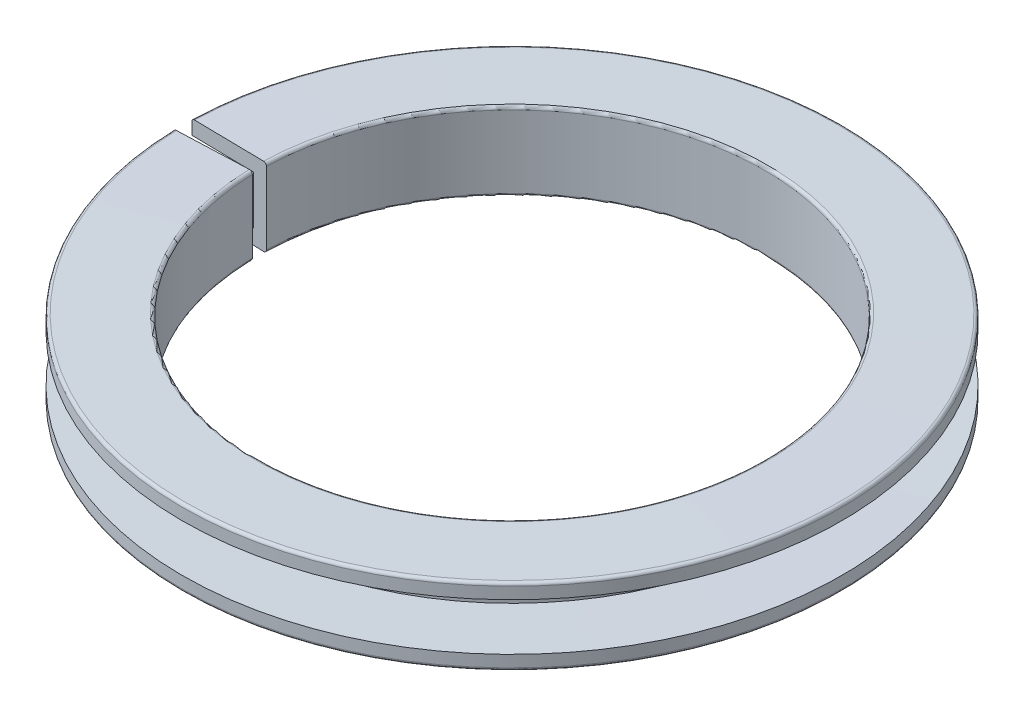
ISO-10303-21;
HEADER;
FILE_DESCRIPTION(('STEP AP214'),'2;1');
FILE_NAME('part.step','',(''),(''),'','','');
FILE_SCHEMA(('AUTOMOTIVE_DESIGN { 1 0 10303 214 1 1 1 1 }'));
ENDSEC;
DATA;
#1=APPLICATION_CONTEXT('core data for automotive mechanical design processes');
#2=APPLICATION_PROTOCOL_DEFINITION('international standard','automotive_design',2000,#1);
#3=PRODUCT_CONTEXT('',#1,'mechanical');
#4=PRODUCT('Part','Part','',(#3));
#5=PRODUCT_RELATED_PRODUCT_CATEGORY('part','',(#4));
#6=PRODUCT_DEFINITION_FORMATION('','',#4);
#7=PRODUCT_DEFINITION_CONTEXT('part definition',#1,'design');
#8=PRODUCT_DEFINITION('design','',#6,#7);
#9=PRODUCT_DEFINITION_SHAPE('','',#8);
#10=(LENGTH_UNIT() NAMED_UNIT(*) SI_UNIT(.MILLI.,.METRE.));
#11=(NAMED_UNIT(*) PLANE_ANGLE_UNIT() SI_UNIT($,.RADIAN.));
#12=(NAMED_UNIT(*) SI_UNIT($,.STERADIAN.) SOLID_ANGLE_UNIT());
#13=UNCERTAINTY_MEASURE_WITH_UNIT(LENGTH_MEASURE(1.E-05),#10,'distance_accuracy_value','');
#14=(GEOMETRIC_REPRESENTATION_CONTEXT(3) GLOBAL_UNCERTAINTY_ASSIGNED_CONTEXT((#13)) GLOBAL_UNIT_ASSIGNED_CONTEXT((#10,
#11,#12)) REPRESENTATION_CONTEXT('',''));
#15=CARTESIAN_POINT('',(0.,0.,0.));
#16=DIRECTION('',(0.,0.,1.));
#17=DIRECTION('',(1.,0.,0.));
#18=AXIS2_PLACEMENT_3D('',#15,#16,#17);
#19=CARTESIAN_POINT('',(-40.0914721200761,-2.39184694475121,-0.613888888888911));
#20=DIRECTION('',(0.0277777777777788,0.,-0.999614123080366));
#21=DIRECTION('',(-0.999614123080366,0.,-0.0277777777777788));
#22=AXIS2_PLACEMENT_3D('',#19,#20,#21);
#23=PLANE('',#22);
#24=DIRECTION('',(0.,1.,0.));
#25=VECTOR('',#24,1.);
#26=CARTESIAN_POINT('',(-35.9930542154466,1.65,-0.500000000000018));
#27=LINE('',#26,#25);
#28=CARTESIAN_POINT('',(-35.9930542154466,-1.65,-0.500000000000018));
#29=VERTEX_POINT('',#28);
#30=CARTESIAN_POINT('',(-35.9930542154466,1.65,-0.500000000000018));
#31=VERTEX_POINT('',#30);
#32=EDGE_CURVE('E69',#29,#31,#27,.T.);
#33=ORIENTED_EDGE('',*,*,#32,.F.);
#34=DIRECTION('',(0.999546551908958,-0.0116271209621438,0.0277759000762335));
#35=VECTOR('',#34,1.);
#36=CARTESIAN_POINT('',(-35.9930542154466,-1.65,-0.500000000000018));
#37=LINE('',#36,#35);
#38=CARTESIAN_POINT('',(-40.2913949446922,-1.6,-0.619444444444466));
#39=VERTEX_POINT('',#38);
#40=EDGE_CURVE('E74',#39,#29,#37,.T.);
#41=ORIENTED_EDGE('',*,*,#40,.F.);
#42=DIRECTION('',(0.,1.,0.));
#43=VECTOR('',#42,1.);
#44=CARTESIAN_POINT('',(-40.2913949446922,-1.6,-0.619444444444467));
#45=LINE('',#44,#43);
#46=CARTESIAN_POINT('',(-40.2913949446922,-2.39184694475121,-0.619444444444466));
#47=VERTEX_POINT('',#46);
#48=EDGE_CURVE('E197',#47,#39,#45,.T.);
#49=ORIENTED_EDGE('',*,*,#48,.F.);
#50=CARTESIAN_POINT('',(-40.0914721200761,-2.39184694475121,-0.613888888888911));
#51=DIRECTION('',(0.0277777777777788,0.,-0.999614123080366));
#52=DIRECTION('',(-0.999614123080366,0.,-0.0277777777777788));
#53=AXIS2_PLACEMENT_3D('',#50,#51,#52);
#54=CIRCLE('',#53,0.2);
#55=CARTESIAN_POINT('',(-40.093796646941,-2.59183342530009,-0.613953484005367));
#56=VERTEX_POINT('',#55);
#57=EDGE_CURVE('E189',#56,#47,#54,.T.);
#58=ORIENTED_EDGE('',*,*,#57,.F.);
#59=DIRECTION('',(-0.999546551908958,0.0116271209621438,-0.0277759000762335));
#60=VECTOR('',#59,1.);
#61=CARTESIAN_POINT('',(-35.2956488561552,-2.64764737878846,-0.480620150672029));
#62=LINE('',#61,#60);
#63=CARTESIAN_POINT('',(-35.2956488561552,-2.64764737878846,-0.480620150672029));
#64=VERTEX_POINT('',#63);
#65=EDGE_CURVE('E181',#64,#56,#62,.T.);
#66=ORIENTED_EDGE('',*,*,#65,.F.);
#67=CARTESIAN_POINT('',(-35.2933243292903,-2.44766089823959,-0.480555555555573));
#68=DIRECTION('',(0.0277777777777788,0.,-0.999614123080366));
#69=DIRECTION('',(-0.999614123080366,0.,-0.0277777777777788));
#70=AXIS2_PLACEMENT_3D('',#67,#68,#69);
#71=CIRCLE('',#70,0.2);
#72=CARTESIAN_POINT('',(-35.0934015046742,-2.44766089823958,-0.475000000000017));
#73=VERTEX_POINT('',#72);
#74=EDGE_CURVE('E173',#73,#64,#71,.T.);
#75=ORIENTED_EDGE('',*,*,#74,.F.);
#76=DIRECTION('',(0.,-1.,0.));
#77=VECTOR('',#76,1.);
#78=CARTESIAN_POINT('',(-35.0934015046742,2.44766089823958,-0.475000000000017));
#79=LINE('',#78,#77);
#80=CARTESIAN_POINT('',(-35.0934015046742,2.44766089823958,-0.475000000000017));
#81=VERTEX_POINT('',#80);
#82=EDGE_CURVE('E165',#81,#73,#79,.T.);
#83=ORIENTED_EDGE('',*,*,#82,.F.);
#84=CARTESIAN_POINT('',(-35.2933243292903,2.44766089823959,-0.480555555555573));
#85=DIRECTION('',(0.0277777777777788,0.,-0.999614123080366));
#86=DIRECTION('',(-0.999614123080366,0.,-0.0277777777777788));
#87=AXIS2_PLACEMENT_3D('',#84,#85,#86);
#88=CIRCLE('',#87,0.2);
#89=CARTESIAN_POINT('',(-35.2956488561552,2.64764737878846,-0.480620150672029));
#90=VERTEX_POINT('',#89);
#91=EDGE_CURVE('E157',#90,#81,#88,.T.);
#92=ORIENTED_EDGE('',*,*,#91,.F.);
#93=DIRECTION('',(0.999546551908958,0.0116271209621438,0.0277759000762335));
#94=VECTOR('',#93,1.);
#95=CARTESIAN_POINT('',(-35.2956488561552,2.64764737878846,-0.480620150672029));
#96=LINE('',#95,#94);
#97=CARTESIAN_POINT('',(-40.093796646941,2.59183342530009,-0.613953484005367));
#98=VERTEX_POINT('',#97);
#99=EDGE_CURVE('E148',#98,#90,#96,.T.);
#100=ORIENTED_EDGE('',*,*,#99,.F.);
#101=CARTESIAN_POINT('',(-40.0914721200761,2.39184694475121,-0.613888888888911));
#102=DIRECTION('',(0.0277777777777788,0.,-0.999614123080366));
#103=DIRECTION('',(0.999614123080366,0.,0.0277777777777788));
#104=AXIS2_PLACEMENT_3D('',#101,#102,#103);
#105=CIRCLE('',#104,0.2);
#106=CARTESIAN_POINT('',(-40.2913949446922,2.39184694475121,-0.619444444444466));
#107=VERTEX_POINT('',#106);
#108=EDGE_CURVE('E125',#107,#98,#105,.T.);
#109=ORIENTED_EDGE('',*,*,#108,.F.);
#110=DIRECTION('',(0.,1.,0.));
#111=VECTOR('',#110,1.);
#112=CARTESIAN_POINT('',(-40.2913949446922,2.39184694475121,-0.619444444444467));
#113=LINE('',#112,#111);
#114=CARTESIAN_POINT('',(-40.2913949446922,1.6,-0.619444444444466));
#115=VERTEX_POINT('',#114);
#116=EDGE_CURVE('E123',#115,#107,#113,.T.);
#117=ORIENTED_EDGE('',*,*,#116,.F.);
#118=DIRECTION('',(-0.999546551908958,-0.0116271209621438,-0.0277759000762335));
#119=VECTOR('',#118,1.);
#120=CARTESIAN_POINT('',(-35.9930542154466,1.65,-0.500000000000018));
#121=LINE('',#120,#119);
#122=EDGE_CURVE('E63',#31,#115,#121,.T.);
#123=ORIENTED_EDGE('',*,*,#122,.F.);
#124=EDGE_LOOP('',(#33,#41,#49,#58,#66,#75,#83,#92,#100,#109,#117,#123));
#125=FACE_BOUND('',#124,.T.);
#126=ADVANCED_FACE('F33',(#125),#23,.F.);
#127=CARTESIAN_POINT('',(-40.0914721200761,-2.39184694475121,0.613888888888881));
#128=DIRECTION('',(-0.0277777777777774,0.,-0.999614123080366));
#129=DIRECTION('',(-0.999614123080366,0.,0.0277777777777774));
#130=AXIS2_PLACEMENT_3D('',#127,#128,#129);
#131=PLANE('',#130);
#132=DIRECTION('',(0.,1.,0.));
#133=VECTOR('',#132,1.);
#134=CARTESIAN_POINT('',(-35.9930542154466,1.65,0.499999999999994));
#135=LINE('',#134,#133);
#136=CARTESIAN_POINT('',(-35.9930542154466,-1.65,0.499999999999994));
#137=VERTEX_POINT('',#136);
#138=CARTESIAN_POINT('',(-35.9930542154466,1.65,0.499999999999994));
#139=VERTEX_POINT('',#138);
#140=EDGE_CURVE('E40',#137,#139,#135,.T.);
#141=ORIENTED_EDGE('',*,*,#140,.T.);
#142=DIRECTION('',(-0.999546551908958,-0.0116271209621438,0.0277759000762322));
#143=VECTOR('',#142,1.);
#144=CARTESIAN_POINT('',(-35.9930542154466,1.65,0.499999999999994));
#145=LINE('',#144,#143);
#146=CARTESIAN_POINT('',(-40.2913949446922,1.6,0.619444444444437));
#147=VERTEX_POINT('',#146);
#148=EDGE_CURVE('E11',#139,#147,#145,.T.);
#149=ORIENTED_EDGE('',*,*,#148,.T.);
#150=DIRECTION('',(0.,1.,0.));
#151=VECTOR('',#150,1.);
#152=CARTESIAN_POINT('',(-40.2913949446922,2.39184694475121,0.619444444444436));
#153=LINE('',#152,#151);
#154=CARTESIAN_POINT('',(-40.2913949446922,2.39184694475121,0.619444444444437));
#155=VERTEX_POINT('',#154);
#156=EDGE_CURVE('E140',#147,#155,#153,.T.);
#157=ORIENTED_EDGE('',*,*,#156,.T.);
#158=CARTESIAN_POINT('',(-40.0914721200761,2.39184694475121,0.613888888888881));
#159=DIRECTION('',(-0.0277777777777774,0.,-0.999614123080366));
#160=DIRECTION('',(0.999614123080366,0.,-0.0277777777777774));
#161=AXIS2_PLACEMENT_3D('',#158,#159,#160);
#162=CIRCLE('',#161,0.2);
#163=CARTESIAN_POINT('',(-40.093796646941,2.59183342530009,0.613953484005338));
#164=VERTEX_POINT('',#163);
#165=EDGE_CURVE('E149',#155,#164,#162,.T.);
#166=ORIENTED_EDGE('',*,*,#165,.T.);
#167=DIRECTION('',(0.999546551908958,0.0116271209621438,-0.0277759000762322));
#168=VECTOR('',#167,1.);
#169=CARTESIAN_POINT('',(-35.2956488561552,2.64764737878846,0.480620150672006));
#170=LINE('',#169,#168);
#171=CARTESIAN_POINT('',(-35.2956488561552,2.64764737878846,0.480620150672006));
#172=VERTEX_POINT('',#171);
#173=EDGE_CURVE('E151',#164,#172,#170,.T.);
#174=ORIENTED_EDGE('',*,*,#173,.T.);
#175=CARTESIAN_POINT('',(-35.2933243292903,2.44766089823959,0.480555555555549));
#176=DIRECTION('',(-0.0277777777777774,0.,-0.999614123080366));
#177=DIRECTION('',(-0.999614123080366,0.,0.0277777777777774));
#178=AXIS2_PLACEMENT_3D('',#175,#176,#177);
#179=CIRCLE('',#178,0.2);
#180=CARTESIAN_POINT('',(-35.0934015046742,2.44766089823958,0.474999999999994));
#181=VERTEX_POINT('',#180);
#182=EDGE_CURVE('E159',#172,#181,#179,.T.);
#183=ORIENTED_EDGE('',*,*,#182,.T.);
#184=DIRECTION('',(0.,-1.,0.));
#185=VECTOR('',#184,1.);
#186=CARTESIAN_POINT('',(-35.0934015046742,2.44766089823958,0.474999999999994));
#187=LINE('',#186,#185);
#188=CARTESIAN_POINT('',(-35.0934015046742,-2.44766089823958,0.474999999999994));
#189=VERTEX_POINT('',#188);
#190=EDGE_CURVE('E167',#181,#189,#187,.T.);
#191=ORIENTED_EDGE('',*,*,#190,.T.);
#192=CARTESIAN_POINT('',(-35.2933243292903,-2.44766089823959,0.480555555555549));
#193=DIRECTION('',(-0.0277777777777774,0.,-0.999614123080366));
#194=DIRECTION('',(-0.999614123080366,0.,0.0277777777777774));
#195=AXIS2_PLACEMENT_3D('',#192,#193,#194);
#196=CIRCLE('',#195,0.2);
#197=CARTESIAN_POINT('',(-35.2956488561552,-2.64764737878846,0.480620150672006));
#198=VERTEX_POINT('',#197);
#199=EDGE_CURVE('E175',#189,#198,#196,.T.);
#200=ORIENTED_EDGE('',*,*,#199,.T.);
#201=DIRECTION('',(-0.999546551908958,0.0116271209621438,0.0277759000762322));
#202=VECTOR('',#201,1.);
#203=CARTESIAN_POINT('',(-35.2956488561552,-2.64764737878846,0.480620150672006));
#204=LINE('',#203,#202);
#205=CARTESIAN_POINT('',(-40.093796646941,-2.59183342530009,0.613953484005338));
#206=VERTEX_POINT('',#205);
#207=EDGE_CURVE('E183',#198,#206,#204,.T.);
#208=ORIENTED_EDGE('',*,*,#207,.T.);
#209=CARTESIAN_POINT('',(-40.0914721200761,-2.39184694475121,0.613888888888881));
#210=DIRECTION('',(-0.0277777777777774,0.,-0.999614123080366));
#211=DIRECTION('',(-0.999614123080366,0.,0.0277777777777774));
#212=AXIS2_PLACEMENT_3D('',#209,#210,#211);
#213=CIRCLE('',#212,0.2);
#214=CARTESIAN_POINT('',(-40.2913949446922,-2.39184694475121,0.619444444444437));
#215=VERTEX_POINT('',#214);
#216=EDGE_CURVE('E191',#206,#215,#213,.T.);
#217=ORIENTED_EDGE('',*,*,#216,.T.);
#218=DIRECTION('',(0.,1.,0.));
#219=VECTOR('',#218,1.);
#220=CARTESIAN_POINT('',(-40.2913949446922,-1.6,0.619444444444436));
#221=LINE('',#220,#219);
#222=CARTESIAN_POINT('',(-40.2913949446922,-1.6,0.619444444444437));
#223=VERTEX_POINT('',#222);
#224=EDGE_CURVE('E199',#215,#223,#221,.T.);
#225=ORIENTED_EDGE('',*,*,#224,.T.);
#226=DIRECTION('',(0.999546551908958,-0.0116271209621438,-0.0277759000762322));
#227=VECTOR('',#226,1.);
#228=CARTESIAN_POINT('',(-35.9930542154466,-1.65,0.499999999999994));
#229=LINE('',#228,#227);
#230=EDGE_CURVE('E51',#223,#137,#229,.T.);
#231=ORIENTED_EDGE('',*,*,#230,.T.);
#232=EDGE_LOOP('',(#141,#149,#157,#166,#174,#183,#191,#200,#208,#217,#225,#231));
#233=FACE_BOUND('',#232,.T.);
#234=ADVANCED_FACE('F216',(#233),#131,.T.);
#235=CARTESIAN_POINT('',(-18.,0.,0.));
#236=DIRECTION('',(0.,-1.,0.));
#237=DIRECTION('',(0.,0.,-1.));
#238=AXIS2_PLACEMENT_3D('',#235,#236,#237);
#239=CYLINDRICAL_SURFACE('',#238,22.3);
#240=CARTESIAN_POINT('',(-18.,2.39184694475121,0.));
#241=DIRECTION('',(0.,-1.,0.));
#242=DIRECTION('',(-0.999614123080366,0.,-0.0277777777777788));
#243=AXIS2_PLACEMENT_3D('',#240,#241,#242);
#244=CIRCLE('',#243,22.3);
#245=EDGE_CURVE('E141',#107,#155,#244,.T.);
#246=ORIENTED_EDGE('',*,*,#245,.T.);
#247=ORIENTED_EDGE('',*,*,#156,.F.);
#248=CARTESIAN_POINT('',(-18.,1.6,0.));
#249=DIRECTION('',(0.,-1.,0.));
#250=DIRECTION('',(-0.999614123080366,0.,-0.0277777777777788));
#251=AXIS2_PLACEMENT_3D('',#248,#249,#250);
#252=CIRCLE('',#251,22.3);
#253=EDGE_CURVE('E135',#115,#147,#252,.T.);
#254=ORIENTED_EDGE('',*,*,#253,.F.);
#255=ORIENTED_EDGE('',*,*,#116,.T.);
#256=EDGE_LOOP('',(#246,#247,#254,#255));
#257=FACE_BOUND('',#256,.T.);
#258=ADVANCED_FACE('F139',(#257),#239,.T.);
#259=CARTESIAN_POINT('',(-18.,2.39184694475121,0.));
#260=DIRECTION('',(0.,-1.,0.));
#261=DIRECTION('',(0.,0.,-1.));
#262=AXIS2_PLACEMENT_3D('',#259,#260,#261);
#263=TOROIDAL_SURFACE('',#262,22.1,0.2);
#264=CARTESIAN_POINT('',(-18.,2.59183342530009,0.));
#265=DIRECTION('',(0.,-1.,0.));
#266=DIRECTION('',(-0.999614123080366,0.,-0.0277777777777788));
#267=AXIS2_PLACEMENT_3D('',#264,#265,#266);
#268=CIRCLE('',#267,22.1023254241924);
#269=EDGE_CURVE('E143',#98,#164,#268,.T.);
#270=ORIENTED_EDGE('',*,*,#269,.T.);
#271=ORIENTED_EDGE('',*,*,#165,.F.);
#272=ORIENTED_EDGE('',*,*,#245,.F.);
#273=ORIENTED_EDGE('',*,*,#108,.T.);
#274=EDGE_LOOP('',(#270,#271,#272,#273));
#275=FACE_BOUND('',#274,.T.);
#276=ADVANCED_FACE('F219',(#275),#263,.T.);
#277=CARTESIAN_POINT('',(-18.,2.59183342530009,0.));
#278=DIRECTION('',(0.,-1.,0.));
#279=DIRECTION('',(0.,0.,-1.));
#280=AXIS2_PLACEMENT_3D('',#277,#278,#279);
#281=CONICAL_SURFACE('',#280,22.1023254241924,1.55916894383851);
#282=CARTESIAN_POINT('',(-18.,2.64764737878846,0.));
#283=DIRECTION('',(0.,-1.,0.));
#284=DIRECTION('',(-0.999614123080366,0.,-0.0277777777777788));
#285=AXIS2_PLACEMENT_3D('',#282,#283,#284);
#286=CIRCLE('',#285,17.3023254241924);
#287=EDGE_CURVE('E154',#90,#172,#286,.T.);
#288=ORIENTED_EDGE('',*,*,#287,.T.);
#289=ORIENTED_EDGE('',*,*,#173,.F.);
#290=ORIENTED_EDGE('',*,*,#269,.F.);
#291=ORIENTED_EDGE('',*,*,#99,.T.);
#292=EDGE_LOOP('',(#288,#289,#290,#291));
#293=FACE_BOUND('',#292,.T.);
#294=ADVANCED_FACE('F222',(#293),#281,.T.);
#295=CARTESIAN_POINT('',(-18.,2.44766089823959,0.));
#296=DIRECTION('',(0.,-1.,0.));
#297=DIRECTION('',(0.,0.,-1.));
#298=AXIS2_PLACEMENT_3D('',#295,#296,#297);
#299=TOROIDAL_SURFACE('',#298,17.3,0.2);
#300=CARTESIAN_POINT('',(-18.,2.44766089823958,0.));
#301=DIRECTION('',(0.,-1.,0.));
#302=DIRECTION('',(-0.999614123080366,0.,-0.0277777777777788));
#303=AXIS2_PLACEMENT_3D('',#300,#301,#302);
#304=CIRCLE('',#303,17.1);
#305=EDGE_CURVE('E162',#81,#181,#304,.T.);
#306=ORIENTED_EDGE('',*,*,#305,.T.);
#307=ORIENTED_EDGE('',*,*,#182,.F.);
#308=ORIENTED_EDGE('',*,*,#287,.F.);
#309=ORIENTED_EDGE('',*,*,#91,.T.);
#310=EDGE_LOOP('',(#306,#307,#308,#309));
#311=FACE_BOUND('',#310,.T.);
#312=ADVANCED_FACE('F227',(#311),#299,.T.);
#313=CARTESIAN_POINT('',(-18.,0.,0.));
#314=DIRECTION('',(0.,-1.,0.));
#315=DIRECTION('',(0.,0.,-1.));
#316=AXIS2_PLACEMENT_3D('',#313,#314,#315);
#317=CYLINDRICAL_SURFACE('',#316,17.1);
#318=CARTESIAN_POINT('',(-18.,-2.44766089823958,0.));
#319=DIRECTION('',(0.,-1.,0.));
#320=DIRECTION('',(-0.999614123080366,0.,-0.0277777777777788));
#321=AXIS2_PLACEMENT_3D('',#318,#319,#320);
#322=CIRCLE('',#321,17.1);
#323=EDGE_CURVE('E170',#73,#189,#322,.T.);
#324=ORIENTED_EDGE('',*,*,#323,.T.);
#325=ORIENTED_EDGE('',*,*,#190,.F.);
#326=ORIENTED_EDGE('',*,*,#305,.F.);
#327=ORIENTED_EDGE('',*,*,#82,.T.);
#328=EDGE_LOOP('',(#324,#325,#326,#327));
#329=FACE_BOUND('',#328,.T.);
#330=ADVANCED_FACE('F230',(#329),#317,.F.);
#331=CARTESIAN_POINT('',(-18.,-2.44766089823959,0.));
#332=DIRECTION('',(0.,-1.,0.));
#333=DIRECTION('',(0.,0.,-1.));
#334=AXIS2_PLACEMENT_3D('',#331,#332,#333);
#335=TOROIDAL_SURFACE('',#334,17.3,0.2);
#336=CARTESIAN_POINT('',(-18.,-2.64764737878846,0.));
#337=DIRECTION('',(0.,-1.,0.));
#338=DIRECTION('',(-0.999614123080366,0.,-0.0277777777777788));
#339=AXIS2_PLACEMENT_3D('',#336,#337,#338);
#340=CIRCLE('',#339,17.3023254241924);
#341=EDGE_CURVE('E178',#64,#198,#340,.T.);
#342=ORIENTED_EDGE('',*,*,#341,.T.);
#343=ORIENTED_EDGE('',*,*,#199,.F.);
#344=ORIENTED_EDGE('',*,*,#323,.F.);
#345=ORIENTED_EDGE('',*,*,#74,.T.);
#346=EDGE_LOOP('',(#342,#343,#344,#345));
#347=FACE_BOUND('',#346,.T.);
#348=ADVANCED_FACE('F235',(#347),#335,.T.);
#349=CARTESIAN_POINT('',(-18.,-2.64764737878846,0.));
#350=DIRECTION('',(0.,1.,0.));
#351=DIRECTION('',(0.,0.,1.));
#352=AXIS2_PLACEMENT_3D('',#349,#350,#351);
#353=CONICAL_SURFACE('',#352,17.3023254241924,1.55916894383851);
#354=CARTESIAN_POINT('',(-18.,-2.59183342530009,0.));
#355=DIRECTION('',(0.,-1.,0.));
#356=DIRECTION('',(-0.999614123080366,0.,-0.0277777777777788));
#357=AXIS2_PLACEMENT_3D('',#354,#355,#356);
#358=CIRCLE('',#357,22.1023254241924);
#359=EDGE_CURVE('E186',#56,#206,#358,.T.);
#360=ORIENTED_EDGE('',*,*,#359,.T.);
#361=ORIENTED_EDGE('',*,*,#207,.F.);
#362=ORIENTED_EDGE('',*,*,#341,.F.);
#363=ORIENTED_EDGE('',*,*,#65,.T.);
#364=EDGE_LOOP('',(#360,#361,#362,#363));
#365=FACE_BOUND('',#364,.T.);
#366=ADVANCED_FACE('F238',(#365),#353,.T.);
#367=CARTESIAN_POINT('',(-18.,-2.39184694475121,0.));
#368=DIRECTION('',(0.,-1.,0.));
#369=DIRECTION('',(0.,0.,-1.));
#370=AXIS2_PLACEMENT_3D('',#367,#368,#369);
#371=TOROIDAL_SURFACE('',#370,22.1,0.2);
#372=CARTESIAN_POINT('',(-18.,-2.39184694475121,0.));
#373=DIRECTION('',(0.,-1.,0.));
#374=DIRECTION('',(-0.999614123080366,0.,-0.0277777777777788));
#375=AXIS2_PLACEMENT_3D('',#372,#373,#374);
#376=CIRCLE('',#375,22.3);
#377=EDGE_CURVE('E194',#47,#215,#376,.T.);
#378=ORIENTED_EDGE('',*,*,#377,.T.);
#379=ORIENTED_EDGE('',*,*,#216,.F.);
#380=ORIENTED_EDGE('',*,*,#359,.F.);
#381=ORIENTED_EDGE('',*,*,#57,.T.);
#382=EDGE_LOOP('',(#378,#379,#380,#381));
#383=FACE_BOUND('',#382,.T.);
#384=ADVANCED_FACE('F243',(#383),#371,.T.);
#385=CARTESIAN_POINT('',(-18.,0.,0.));
#386=DIRECTION('',(0.,-1.,0.));
#387=DIRECTION('',(0.,0.,-1.));
#388=AXIS2_PLACEMENT_3D('',#385,#386,#387);
#389=CYLINDRICAL_SURFACE('',#388,22.3);
#390=CARTESIAN_POINT('',(-18.,-1.6,0.));
#391=DIRECTION('',(0.,-1.,0.));
#392=DIRECTION('',(-0.999614123080366,0.,-0.0277777777777788));
#393=AXIS2_PLACEMENT_3D('',#390,#391,#392);
#394=CIRCLE('',#393,22.3);
#395=EDGE_CURVE('E202',#39,#223,#394,.T.);
#396=ORIENTED_EDGE('',*,*,#395,.T.);
#397=ORIENTED_EDGE('',*,*,#224,.F.);
#398=ORIENTED_EDGE('',*,*,#377,.F.);
#399=ORIENTED_EDGE('',*,*,#48,.T.);
#400=EDGE_LOOP('',(#396,#397,#398,#399));
#401=FACE_BOUND('',#400,.T.);
#402=ADVANCED_FACE('F246',(#401),#389,.T.);
#403=CARTESIAN_POINT('',(-18.,-1.6,0.));
#404=DIRECTION('',(0.,1.,0.));
#405=DIRECTION('',(0.,0.,1.));
#406=AXIS2_PLACEMENT_3D('',#403,#404,#405);
#407=CONICAL_SURFACE('',#406,22.3,1.55916894383851);
#408=CARTESIAN_POINT('',(-18.,-1.65,0.));
#409=DIRECTION('',(0.,-1.,0.));
#410=DIRECTION('',(-0.999614123080366,0.,-0.0277777777777788));
#411=AXIS2_PLACEMENT_3D('',#408,#409,#410);
#412=CIRCLE('',#411,18.);
#413=EDGE_CURVE('E207',#29,#137,#412,.T.);
#414=ORIENTED_EDGE('',*,*,#413,.T.);
#415=ORIENTED_EDGE('',*,*,#230,.F.);
#416=ORIENTED_EDGE('',*,*,#395,.F.);
#417=ORIENTED_EDGE('',*,*,#40,.T.);
#418=EDGE_LOOP('',(#414,#415,#416,#417));
#419=FACE_BOUND('',#418,.T.);
#420=ADVANCED_FACE('F249',(#419),#407,.F.);
#421=CARTESIAN_POINT('',(-18.,0.,0.));
#422=DIRECTION('',(0.,-1.,0.));
#423=DIRECTION('',(0.,0.,-1.));
#424=AXIS2_PLACEMENT_3D('',#421,#422,#423);
#425=CYLINDRICAL_SURFACE('',#424,18.);
#426=CARTESIAN_POINT('',(-18.,1.65,0.));
#427=DIRECTION('',(0.,-1.,0.));
#428=DIRECTION('',(-0.999614123080366,0.,-0.0277777777777788));
#429=AXIS2_PLACEMENT_3D('',#426,#427,#428);
#430=CIRCLE('',#429,18.);
#431=EDGE_CURVE('E137',#31,#139,#430,.T.);
#432=ORIENTED_EDGE('',*,*,#431,.T.);
#433=ORIENTED_EDGE('',*,*,#140,.F.);
#434=ORIENTED_EDGE('',*,*,#413,.F.);
#435=ORIENTED_EDGE('',*,*,#32,.T.);
#436=EDGE_LOOP('',(#432,#433,#434,#435));
#437=FACE_BOUND('',#436,.T.);
#438=ADVANCED_FACE('F251',(#437),#425,.T.);
#439=CARTESIAN_POINT('',(-18.,1.65,0.));
#440=DIRECTION('',(0.,-1.,0.));
#441=DIRECTION('',(0.,0.,-1.));
#442=AXIS2_PLACEMENT_3D('',#439,#440,#441);
#443=CONICAL_SURFACE('',#442,18.,1.55916894383851);
#444=ORIENTED_EDGE('',*,*,#148,.F.);
#445=ORIENTED_EDGE('',*,*,#431,.F.);
#446=ORIENTED_EDGE('',*,*,#122,.T.);
#447=ORIENTED_EDGE('',*,*,#253,.T.);
#448=EDGE_LOOP('',(#444,#445,#446,#447));
#449=FACE_BOUND('',#448,.T.);
#450=ADVANCED_FACE('F134',(#449),#443,.F.);
#451=CLOSED_SHELL('',(#126,#234,#258,#276,#294,#312,#330,#348,#366,#384,#402,#420,#438,#450));
#452=MANIFOLD_SOLID_BREP('B2',#451);
#453=ADVANCED_BREP_SHAPE_REPRESENTATION('',(#18,#452),#14);
#454=SHAPE_DEFINITION_REPRESENTATION(#9,#453);
ENDSEC;
END-ISO-10303-21;
